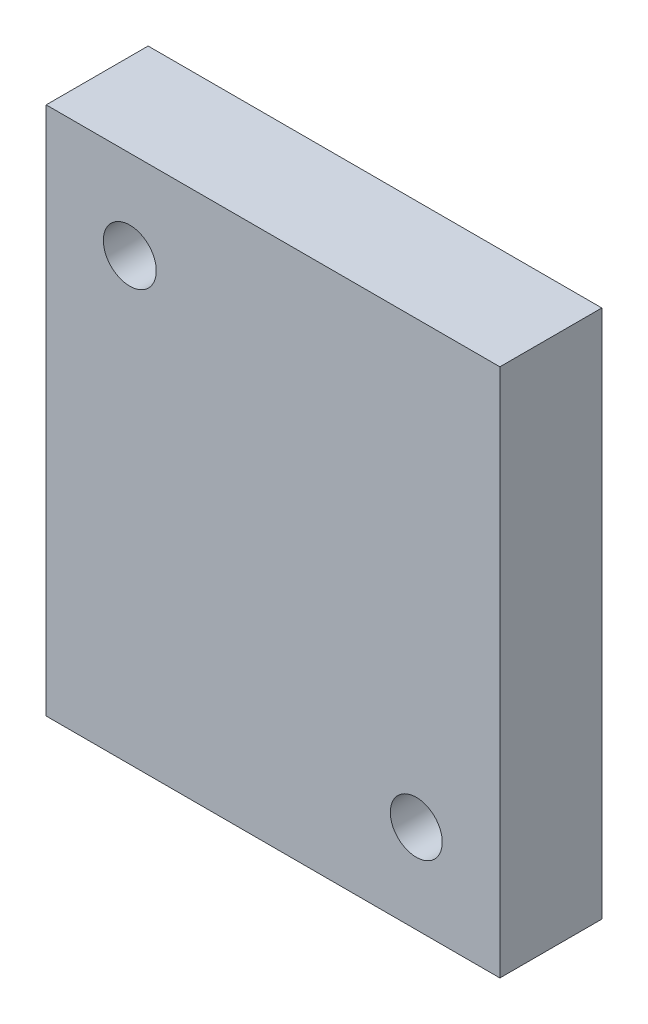
ISO-10303-21;
HEADER;
FILE_DESCRIPTION(('STEP AP214'),'2;1');
FILE_NAME('part.step','',(''),(''),'','','');
FILE_SCHEMA(('AUTOMOTIVE_DESIGN { 1 0 10303 214 1 1 1 1 }'));
ENDSEC;
DATA;
#1=APPLICATION_CONTEXT('core data for automotive mechanical design processes');
#2=APPLICATION_PROTOCOL_DEFINITION('international standard','automotive_design',2000,#1);
#3=PRODUCT_CONTEXT('',#1,'mechanical');
#4=PRODUCT('Part','Part','',(#3));
#5=PRODUCT_RELATED_PRODUCT_CATEGORY('part','',(#4));
#6=PRODUCT_DEFINITION_FORMATION('','',#4);
#7=PRODUCT_DEFINITION_CONTEXT('part definition',#1,'design');
#8=PRODUCT_DEFINITION('design','',#6,#7);
#9=PRODUCT_DEFINITION_SHAPE('','',#8);
#10=(LENGTH_UNIT() NAMED_UNIT(*) SI_UNIT(.MILLI.,.METRE.));
#11=(NAMED_UNIT(*) PLANE_ANGLE_UNIT() SI_UNIT($,.RADIAN.));
#12=(NAMED_UNIT(*) SI_UNIT($,.STERADIAN.) SOLID_ANGLE_UNIT());
#13=UNCERTAINTY_MEASURE_WITH_UNIT(LENGTH_MEASURE(1.E-05),#10,'distance_accuracy_value','');
#14=(GEOMETRIC_REPRESENTATION_CONTEXT(3) GLOBAL_UNCERTAINTY_ASSIGNED_CONTEXT((#13)) GLOBAL_UNIT_ASSIGNED_CONTEXT((#10,
#11,#12)) REPRESENTATION_CONTEXT('',''));
#15=CARTESIAN_POINT('',(0.,0.,0.));
#16=DIRECTION('',(0.,0.,1.));
#17=DIRECTION('',(1.,0.,0.));
#18=AXIS2_PLACEMENT_3D('',#15,#16,#17);
#19=CARTESIAN_POINT('',(30.,35.,13.48));
#20=DIRECTION('',(-1.,0.,0.));
#21=DIRECTION('',(0.,0.,1.));
#22=AXIS2_PLACEMENT_3D('',#19,#20,#21);
#23=PLANE('',#22);
#24=DIRECTION('',(0.,1.,0.));
#25=VECTOR('',#24,1.);
#26=CARTESIAN_POINT('',(30.,35.,0.));
#27=LINE('',#26,#25);
#28=CARTESIAN_POINT('',(30.,-35.,0.));
#29=VERTEX_POINT('',#28);
#30=CARTESIAN_POINT('',(30.,35.,0.));
#31=VERTEX_POINT('',#30);
#32=EDGE_CURVE('E116',#29,#31,#27,.T.);
#33=ORIENTED_EDGE('',*,*,#32,.T.);
#34=DIRECTION('',(0.,0.,-1.));
#35=VECTOR('',#34,1.);
#36=CARTESIAN_POINT('',(30.,35.,13.48));
#37=LINE('',#36,#35);
#38=CARTESIAN_POINT('',(30.,35.,13.48));
#39=VERTEX_POINT('',#38);
#40=EDGE_CURVE('E12',#39,#31,#37,.T.);
#41=ORIENTED_EDGE('',*,*,#40,.F.);
#42=DIRECTION('',(0.,1.,0.));
#43=VECTOR('',#42,1.);
#44=CARTESIAN_POINT('',(30.,35.,13.48));
#45=LINE('',#44,#43);
#46=CARTESIAN_POINT('',(30.,-35.,13.48));
#47=VERTEX_POINT('',#46);
#48=EDGE_CURVE('E93',#47,#39,#45,.T.);
#49=ORIENTED_EDGE('',*,*,#48,.F.);
#50=DIRECTION('',(0.,0.,-1.));
#51=VECTOR('',#50,1.);
#52=CARTESIAN_POINT('',(30.,-35.,13.48));
#53=LINE('',#52,#51);
#54=EDGE_CURVE('E101',#47,#29,#53,.T.);
#55=ORIENTED_EDGE('',*,*,#54,.T.);
#56=EDGE_LOOP('',(#33,#41,#49,#55));
#57=FACE_BOUND('',#56,.T.);
#58=ADVANCED_FACE('F41',(#57),#23,.F.);
#59=CARTESIAN_POINT('',(-30.,35.,13.48));
#60=DIRECTION('',(0.,-1.,0.));
#61=DIRECTION('',(0.,0.,-1.));
#62=AXIS2_PLACEMENT_3D('',#59,#60,#61);
#63=PLANE('',#62);
#64=DIRECTION('',(-1.,0.,0.));
#65=VECTOR('',#64,1.);
#66=CARTESIAN_POINT('',(-30.,35.,0.));
#67=LINE('',#66,#65);
#68=CARTESIAN_POINT('',(-30.,35.,0.));
#69=VERTEX_POINT('',#68);
#70=EDGE_CURVE('E97',#31,#69,#67,.T.);
#71=ORIENTED_EDGE('',*,*,#70,.T.);
#72=DIRECTION('',(0.,0.,-1.));
#73=VECTOR('',#72,1.);
#74=CARTESIAN_POINT('',(-30.,35.,13.48));
#75=LINE('',#74,#73);
#76=CARTESIAN_POINT('',(-30.,35.,13.48));
#77=VERTEX_POINT('',#76);
#78=EDGE_CURVE('E50',#77,#69,#75,.T.);
#79=ORIENTED_EDGE('',*,*,#78,.F.);
#80=DIRECTION('',(-1.,0.,0.));
#81=VECTOR('',#80,1.);
#82=CARTESIAN_POINT('',(-30.,35.,13.48));
#83=LINE('',#82,#81);
#84=EDGE_CURVE('E88',#39,#77,#83,.T.);
#85=ORIENTED_EDGE('',*,*,#84,.F.);
#86=ORIENTED_EDGE('',*,*,#40,.T.);
#87=EDGE_LOOP('',(#71,#79,#85,#86));
#88=FACE_BOUND('',#87,.T.);
#89=ADVANCED_FACE('F96',(#88),#63,.F.);
#90=CARTESIAN_POINT('',(-30.,35.,13.48));
#91=DIRECTION('',(1.,0.,0.));
#92=DIRECTION('',(0.,0.,-1.));
#93=AXIS2_PLACEMENT_3D('',#90,#91,#92);
#94=PLANE('',#93);
#95=DIRECTION('',(0.,-1.,0.));
#96=VECTOR('',#95,1.);
#97=CARTESIAN_POINT('',(-30.,35.,0.));
#98=LINE('',#97,#96);
#99=CARTESIAN_POINT('',(-30.,-35.,0.));
#100=VERTEX_POINT('',#99);
#101=EDGE_CURVE('E75',#69,#100,#98,.T.);
#102=ORIENTED_EDGE('',*,*,#101,.T.);
#103=DIRECTION('',(0.,0.,-1.));
#104=VECTOR('',#103,1.);
#105=CARTESIAN_POINT('',(-30.,-35.,13.48));
#106=LINE('',#105,#104);
#107=CARTESIAN_POINT('',(-30.,-35.,13.48));
#108=VERTEX_POINT('',#107);
#109=EDGE_CURVE('E98',#108,#100,#106,.T.);
#110=ORIENTED_EDGE('',*,*,#109,.F.);
#111=DIRECTION('',(0.,-1.,0.));
#112=VECTOR('',#111,1.);
#113=CARTESIAN_POINT('',(-30.,35.,13.48));
#114=LINE('',#113,#112);
#115=EDGE_CURVE('E91',#77,#108,#114,.T.);
#116=ORIENTED_EDGE('',*,*,#115,.F.);
#117=ORIENTED_EDGE('',*,*,#78,.T.);
#118=EDGE_LOOP('',(#102,#110,#116,#117));
#119=FACE_BOUND('',#118,.T.);
#120=ADVANCED_FACE('F99',(#119),#94,.F.);
#121=CARTESIAN_POINT('',(-30.,-35.,13.48));
#122=DIRECTION('',(0.,1.,0.));
#123=DIRECTION('',(0.,0.,1.));
#124=AXIS2_PLACEMENT_3D('',#121,#122,#123);
#125=PLANE('',#124);
#126=DIRECTION('',(1.,0.,0.));
#127=VECTOR('',#126,1.);
#128=CARTESIAN_POINT('',(-30.,-35.,0.));
#129=LINE('',#128,#127);
#130=EDGE_CURVE('E81',#100,#29,#129,.T.);
#131=ORIENTED_EDGE('',*,*,#130,.T.);
#132=ORIENTED_EDGE('',*,*,#54,.F.);
#133=DIRECTION('',(1.,0.,0.));
#134=VECTOR('',#133,1.);
#135=CARTESIAN_POINT('',(-30.,-35.,13.48));
#136=LINE('',#135,#134);
#137=EDGE_CURVE('E58',#108,#47,#136,.T.);
#138=ORIENTED_EDGE('',*,*,#137,.F.);
#139=ORIENTED_EDGE('',*,*,#109,.T.);
#140=EDGE_LOOP('',(#131,#132,#138,#139));
#141=FACE_BOUND('',#140,.T.);
#142=ADVANCED_FACE('F158',(#141),#125,.F.);
#143=CARTESIAN_POINT('',(0.,0.,13.48));
#144=DIRECTION('',(0.,0.,1.));
#145=DIRECTION('',(1.,0.,0.));
#146=AXIS2_PLACEMENT_3D('',#143,#144,#145);
#147=PLANE('',#146);
#148=CARTESIAN_POINT('',(18.9425412312998,-23.2632786103014,13.48));
#149=DIRECTION('',(0.,0.,1.));
#150=DIRECTION('',(1.,0.,0.));
#151=AXIS2_PLACEMENT_3D('',#148,#149,#150);
#152=CIRCLE('',#151,3.4348719797879);
#153=CARTESIAN_POINT('',(15.5076692515119,-23.2632786103014,13.48));
#154=VERTEX_POINT('',#153);
#155=EDGE_CURVE('E112',#154,#154,#152,.T.);
#156=ORIENTED_EDGE('',*,*,#155,.F.);
#157=EDGE_LOOP('',(#156));
#158=FACE_BOUND('',#157,.T.);
#159=CARTESIAN_POINT('',(-18.9425412312998,23.2632786103014,13.48));
#160=DIRECTION('',(0.,0.,1.));
#161=DIRECTION('',(1.,0.,0.));
#162=AXIS2_PLACEMENT_3D('',#159,#160,#161);
#163=CIRCLE('',#162,3.5);
#164=CARTESIAN_POINT('',(-22.4425412312998,23.2632786103014,13.48));
#165=VERTEX_POINT('',#164);
#166=EDGE_CURVE('E117',#165,#165,#163,.T.);
#167=ORIENTED_EDGE('',*,*,#166,.F.);
#168=EDGE_LOOP('',(#167));
#169=FACE_BOUND('',#168,.T.);
#170=ORIENTED_EDGE('',*,*,#48,.T.);
#171=ORIENTED_EDGE('',*,*,#84,.T.);
#172=ORIENTED_EDGE('',*,*,#115,.T.);
#173=ORIENTED_EDGE('',*,*,#137,.T.);
#174=EDGE_LOOP('',(#170,#171,#172,#173));
#175=FACE_BOUND('',#174,.T.);
#176=ADVANCED_FACE('F89',(#158,#169,#175),#147,.T.);
#177=CARTESIAN_POINT('',(0.,0.,0.));
#178=DIRECTION('',(0.,0.,1.));
#179=DIRECTION('',(1.,0.,0.));
#180=AXIS2_PLACEMENT_3D('',#177,#178,#179);
#181=PLANE('',#180);
#182=CARTESIAN_POINT('',(18.9425412312998,-23.2632786103014,0.));
#183=DIRECTION('',(0.,0.,-1.));
#184=DIRECTION('',(-1.,0.,0.));
#185=AXIS2_PLACEMENT_3D('',#182,#183,#184);
#186=CIRCLE('',#185,3.4348719797879);
#187=CARTESIAN_POINT('',(15.5076692515119,-23.2632786103014,0.));
#188=VERTEX_POINT('',#187);
#189=EDGE_CURVE('E145',#188,#188,#186,.T.);
#190=ORIENTED_EDGE('',*,*,#189,.F.);
#191=EDGE_LOOP('',(#190));
#192=FACE_BOUND('',#191,.T.);
#193=CARTESIAN_POINT('',(-18.9425412312998,23.2632786103014,0.));
#194=DIRECTION('',(0.,0.,-1.));
#195=DIRECTION('',(-1.,0.,0.));
#196=AXIS2_PLACEMENT_3D('',#193,#194,#195);
#197=CIRCLE('',#196,3.5);
#198=CARTESIAN_POINT('',(-22.4425412312998,23.2632786103014,0.));
#199=VERTEX_POINT('',#198);
#200=EDGE_CURVE('E142',#199,#199,#197,.T.);
#201=ORIENTED_EDGE('',*,*,#200,.F.);
#202=EDGE_LOOP('',(#201));
#203=FACE_BOUND('',#202,.T.);
#204=ORIENTED_EDGE('',*,*,#32,.F.);
#205=ORIENTED_EDGE('',*,*,#130,.F.);
#206=ORIENTED_EDGE('',*,*,#101,.F.);
#207=ORIENTED_EDGE('',*,*,#70,.F.);
#208=EDGE_LOOP('',(#204,#205,#206,#207));
#209=FACE_BOUND('',#208,.T.);
#210=ADVANCED_FACE('F157',(#192,#203,#209),#181,.F.);
#211=CARTESIAN_POINT('',(-18.9425412312998,23.2632786103014,29.));
#212=DIRECTION('',(0.,0.,-1.));
#213=DIRECTION('',(-1.,0.,0.));
#214=AXIS2_PLACEMENT_3D('',#211,#212,#213);
#215=CYLINDRICAL_SURFACE('',#214,3.5);
#216=CARTESIAN_POINT('',(-22.4425412312998,23.2632786103014,13.48));
#217=CARTESIAN_POINT('',(-22.4425412312998,23.2632786103014,13.3395833333333));
#218=CARTESIAN_POINT('',(-22.4425412312998,23.2632786103014,13.1991666666667));
#219=CARTESIAN_POINT('',(-22.4425412312998,23.2632786103014,12.9183333333333));
#220=CARTESIAN_POINT('',(-22.4425412312998,23.2632786103014,12.7779166666667));
#221=CARTESIAN_POINT('',(-22.4425412312998,23.2632786103014,12.4970833333333));
#222=CARTESIAN_POINT('',(-22.4425412312998,23.2632786103014,12.3566666666667));
#223=CARTESIAN_POINT('',(-22.4425412312998,23.2632786103014,12.0758333333333));
#224=CARTESIAN_POINT('',(-22.4425412312998,23.2632786103014,11.9354166666667));
#225=CARTESIAN_POINT('',(-22.4425412312998,23.2632786103014,11.6545833333333));
#226=CARTESIAN_POINT('',(-22.4425412312998,23.2632786103014,11.5141666666667));
#227=CARTESIAN_POINT('',(-22.4425412312998,23.2632786103014,11.2333333333333));
#228=CARTESIAN_POINT('',(-22.4425412312998,23.2632786103014,11.0929166666667));
#229=CARTESIAN_POINT('',(-22.4425412312998,23.2632786103014,10.8120833333333));
#230=CARTESIAN_POINT('',(-22.4425412312998,23.2632786103014,10.6716666666667));
#231=CARTESIAN_POINT('',(-22.4425412312998,23.2632786103014,10.3908333333333));
#232=CARTESIAN_POINT('',(-22.4425412312998,23.2632786103014,10.2504166666667));
#233=CARTESIAN_POINT('',(-22.4425412312998,23.2632786103014,9.96958333333334));
#234=CARTESIAN_POINT('',(-22.4425412312998,23.2632786103014,9.82916666666667));
#235=CARTESIAN_POINT('',(-22.4425412312998,23.2632786103014,9.54833333333334));
#236=CARTESIAN_POINT('',(-22.4425412312998,23.2632786103014,9.40791666666667));
#237=CARTESIAN_POINT('',(-22.4425412312998,23.2632786103014,9.12708333333333));
#238=CARTESIAN_POINT('',(-22.4425412312998,23.2632786103014,8.98666666666667));
#239=CARTESIAN_POINT('',(-22.4425412312998,23.2632786103014,8.70583333333333));
#240=CARTESIAN_POINT('',(-22.4425412312998,23.2632786103014,8.56541666666667));
#241=CARTESIAN_POINT('',(-22.4425412312998,23.2632786103014,8.28458333333334));
#242=CARTESIAN_POINT('',(-22.4425412312998,23.2632786103014,8.14416666666667));
#243=CARTESIAN_POINT('',(-22.4425412312998,23.2632786103014,7.86333333333334));
#244=CARTESIAN_POINT('',(-22.4425412312998,23.2632786103014,7.72291666666667));
#245=CARTESIAN_POINT('',(-22.4425412312998,23.2632786103014,7.44208333333334));
#246=CARTESIAN_POINT('',(-22.4425412312998,23.2632786103014,7.30166666666667));
#247=CARTESIAN_POINT('',(-22.4425412312998,23.2632786103014,7.02083333333333));
#248=CARTESIAN_POINT('',(-22.4425412312998,23.2632786103014,6.88041666666667));
#249=CARTESIAN_POINT('',(-22.4425412312998,23.2632786103014,6.59958333333334));
#250=CARTESIAN_POINT('',(-22.4425412312998,23.2632786103014,6.45916666666667));
#251=CARTESIAN_POINT('',(-22.4425412312998,23.2632786103014,6.17833333333333));
#252=CARTESIAN_POINT('',(-22.4425412312998,23.2632786103014,6.03791666666667));
#253=CARTESIAN_POINT('',(-22.4425412312998,23.2632786103014,5.75708333333333));
#254=CARTESIAN_POINT('',(-22.4425412312998,23.2632786103014,5.61666666666667));
#255=CARTESIAN_POINT('',(-22.4425412312998,23.2632786103014,5.33583333333334));
#256=CARTESIAN_POINT('',(-22.4425412312998,23.2632786103014,5.19541666666667));
#257=CARTESIAN_POINT('',(-22.4425412312998,23.2632786103014,4.91458333333333));
#258=CARTESIAN_POINT('',(-22.4425412312998,23.2632786103014,4.77416666666667));
#259=CARTESIAN_POINT('',(-22.4425412312998,23.2632786103014,4.49333333333333));
#260=CARTESIAN_POINT('',(-22.4425412312998,23.2632786103014,4.35291666666667));
#261=CARTESIAN_POINT('',(-22.4425412312998,23.2632786103014,4.07208333333333));
#262=CARTESIAN_POINT('',(-22.4425412312998,23.2632786103014,3.93166666666667));
#263=CARTESIAN_POINT('',(-22.4425412312998,23.2632786103014,3.65083333333334));
#264=CARTESIAN_POINT('',(-22.4425412312998,23.2632786103014,3.51041666666667));
#265=CARTESIAN_POINT('',(-22.4425412312998,23.2632786103014,3.22958333333333));
#266=CARTESIAN_POINT('',(-22.4425412312998,23.2632786103014,3.08916666666667));
#267=CARTESIAN_POINT('',(-22.4425412312998,23.2632786103014,2.80833333333333));
#268=CARTESIAN_POINT('',(-22.4425412312998,23.2632786103014,2.66791666666667));
#269=CARTESIAN_POINT('',(-22.4425412312998,23.2632786103014,2.38708333333333));
#270=CARTESIAN_POINT('',(-22.4425412312998,23.2632786103014,2.24666666666667));
#271=CARTESIAN_POINT('',(-22.4425412312998,23.2632786103014,1.96583333333333));
#272=CARTESIAN_POINT('',(-22.4425412312998,23.2632786103014,1.82541666666667));
#273=CARTESIAN_POINT('',(-22.4425412312998,23.2632786103014,1.54458333333333));
#274=CARTESIAN_POINT('',(-22.4425412312998,23.2632786103014,1.40416666666667));
#275=CARTESIAN_POINT('',(-22.4425412312998,23.2632786103014,1.12333333333333));
#276=CARTESIAN_POINT('',(-22.4425412312998,23.2632786103014,0.982916666666667));
#277=CARTESIAN_POINT('',(-22.4425412312998,23.2632786103014,0.702083333333332));
#278=CARTESIAN_POINT('',(-22.4425412312998,23.2632786103014,0.561666666666665));
#279=CARTESIAN_POINT('',(-22.4425412312998,23.2632786103014,0.280833333333332));
#280=CARTESIAN_POINT('',(-22.4425412312998,23.2632786103014,0.140416666666666));
#281=CARTESIAN_POINT('',(-22.4425412312998,23.2632786103014,0.));
#282=B_SPLINE_CURVE_WITH_KNOTS('',3,(#216,#217,#218,#219,#220,#221,#222,#223,#224,#225,#226,
#227,#228,#229,#230,#231,#232,#233,#234,#235,#236,#237,#238,#239,#240,#241,#242,#243,#244,#245,
#246,#247,#248,#249,#250,#251,#252,#253,#254,#255,#256,#257,#258,#259,#260,#261,#262,#263,#264,
#265,#266,#267,#268,#269,#270,#271,#272,#273,#274,#275,#276,#277,#278,#279,#280,#281),
.UNSPECIFIED.,.F.,.F.,(4,2,2,2,2,2,2,2,2,2,2,2,2,2,2,2,2,2,2,2,2,2,2,2,2,2,2,2,2,2,2,2,4),(0.,
0.42125,0.842499999999998,1.26375,1.685,2.10625,2.5275,2.94875,3.37,3.79125,4.2125,4.63375,
5.055,5.47625,5.8975,6.31875,6.74,7.16125,7.5825,8.00375,8.425,8.84625,9.2675,9.68875,10.11,
10.53125,10.9525,11.37375,11.795,12.21625,12.6375,13.05875,13.48),.UNSPECIFIED.);
#283=EDGE_CURVE('BSEAM153',#165,#199,#282,.T.);
#284=ORIENTED_EDGE('',*,*,#166,.T.);
#285=ORIENTED_EDGE('',*,*,#200,.T.);
#286=ORIENTED_EDGE('',*,*,#283,.T.);
#287=ORIENTED_EDGE('',*,*,#283,.F.);
#288=EDGE_LOOP('',(#284,#286,#285,#287));
#289=FACE_BOUND('',#288,.T.);
#290=ADVANCED_FACE('F153',(#289),#215,.F.);
#291=CARTESIAN_POINT('',(18.9425412312998,-23.2632786103014,29.));
#292=DIRECTION('',(0.,0.,-1.));
#293=DIRECTION('',(-1.,0.,0.));
#294=AXIS2_PLACEMENT_3D('',#291,#292,#293);
#295=CYLINDRICAL_SURFACE('',#294,3.4348719797879);
#296=CARTESIAN_POINT('',(15.5076692515119,-23.2632786103014,13.48));
#297=CARTESIAN_POINT('',(15.5076692515119,-23.2632786103014,13.3395833333333));
#298=CARTESIAN_POINT('',(15.5076692515119,-23.2632786103014,13.1991666666667));
#299=CARTESIAN_POINT('',(15.5076692515119,-23.2632786103014,12.9183333333333));
#300=CARTESIAN_POINT('',(15.5076692515119,-23.2632786103014,12.7779166666667));
#301=CARTESIAN_POINT('',(15.5076692515119,-23.2632786103014,12.4970833333333));
#302=CARTESIAN_POINT('',(15.5076692515119,-23.2632786103014,12.3566666666667));
#303=CARTESIAN_POINT('',(15.5076692515119,-23.2632786103014,12.0758333333333));
#304=CARTESIAN_POINT('',(15.5076692515119,-23.2632786103014,11.9354166666667));
#305=CARTESIAN_POINT('',(15.5076692515119,-23.2632786103014,11.6545833333333));
#306=CARTESIAN_POINT('',(15.5076692515119,-23.2632786103014,11.5141666666667));
#307=CARTESIAN_POINT('',(15.5076692515119,-23.2632786103014,11.2333333333333));
#308=CARTESIAN_POINT('',(15.5076692515119,-23.2632786103014,11.0929166666667));
#309=CARTESIAN_POINT('',(15.5076692515119,-23.2632786103014,10.8120833333333));
#310=CARTESIAN_POINT('',(15.5076692515119,-23.2632786103014,10.6716666666667));
#311=CARTESIAN_POINT('',(15.5076692515119,-23.2632786103014,10.3908333333333));
#312=CARTESIAN_POINT('',(15.5076692515119,-23.2632786103014,10.2504166666667));
#313=CARTESIAN_POINT('',(15.5076692515119,-23.2632786103014,9.96958333333334));
#314=CARTESIAN_POINT('',(15.5076692515119,-23.2632786103014,9.82916666666667));
#315=CARTESIAN_POINT('',(15.5076692515119,-23.2632786103014,9.54833333333334));
#316=CARTESIAN_POINT('',(15.5076692515119,-23.2632786103014,9.40791666666667));
#317=CARTESIAN_POINT('',(15.5076692515119,-23.2632786103014,9.12708333333333));
#318=CARTESIAN_POINT('',(15.5076692515119,-23.2632786103014,8.98666666666667));
#319=CARTESIAN_POINT('',(15.5076692515119,-23.2632786103014,8.70583333333333));
#320=CARTESIAN_POINT('',(15.5076692515119,-23.2632786103014,8.56541666666667));
#321=CARTESIAN_POINT('',(15.5076692515119,-23.2632786103014,8.28458333333334));
#322=CARTESIAN_POINT('',(15.5076692515119,-23.2632786103014,8.14416666666667));
#323=CARTESIAN_POINT('',(15.5076692515119,-23.2632786103014,7.86333333333334));
#324=CARTESIAN_POINT('',(15.5076692515119,-23.2632786103014,7.72291666666667));
#325=CARTESIAN_POINT('',(15.5076692515119,-23.2632786103014,7.44208333333334));
#326=CARTESIAN_POINT('',(15.5076692515119,-23.2632786103014,7.30166666666667));
#327=CARTESIAN_POINT('',(15.5076692515119,-23.2632786103014,7.02083333333333));
#328=CARTESIAN_POINT('',(15.5076692515119,-23.2632786103014,6.88041666666667));
#329=CARTESIAN_POINT('',(15.5076692515119,-23.2632786103014,6.59958333333334));
#330=CARTESIAN_POINT('',(15.5076692515119,-23.2632786103014,6.45916666666667));
#331=CARTESIAN_POINT('',(15.5076692515119,-23.2632786103014,6.17833333333333));
#332=CARTESIAN_POINT('',(15.5076692515119,-23.2632786103014,6.03791666666667));
#333=CARTESIAN_POINT('',(15.5076692515119,-23.2632786103014,5.75708333333333));
#334=CARTESIAN_POINT('',(15.5076692515119,-23.2632786103014,5.61666666666667));
#335=CARTESIAN_POINT('',(15.5076692515119,-23.2632786103014,5.33583333333334));
#336=CARTESIAN_POINT('',(15.5076692515119,-23.2632786103014,5.19541666666667));
#337=CARTESIAN_POINT('',(15.5076692515119,-23.2632786103014,4.91458333333333));
#338=CARTESIAN_POINT('',(15.5076692515119,-23.2632786103014,4.77416666666667));
#339=CARTESIAN_POINT('',(15.5076692515119,-23.2632786103014,4.49333333333333));
#340=CARTESIAN_POINT('',(15.5076692515119,-23.2632786103014,4.35291666666667));
#341=CARTESIAN_POINT('',(15.5076692515119,-23.2632786103014,4.07208333333333));
#342=CARTESIAN_POINT('',(15.5076692515119,-23.2632786103014,3.93166666666667));
#343=CARTESIAN_POINT('',(15.5076692515119,-23.2632786103014,3.65083333333334));
#344=CARTESIAN_POINT('',(15.5076692515119,-23.2632786103014,3.51041666666667));
#345=CARTESIAN_POINT('',(15.5076692515119,-23.2632786103014,3.22958333333333));
#346=CARTESIAN_POINT('',(15.5076692515119,-23.2632786103014,3.08916666666667));
#347=CARTESIAN_POINT('',(15.5076692515119,-23.2632786103014,2.80833333333333));
#348=CARTESIAN_POINT('',(15.5076692515119,-23.2632786103014,2.66791666666667));
#349=CARTESIAN_POINT('',(15.5076692515119,-23.2632786103014,2.38708333333333));
#350=CARTESIAN_POINT('',(15.5076692515119,-23.2632786103014,2.24666666666667));
#351=CARTESIAN_POINT('',(15.5076692515119,-23.2632786103014,1.96583333333333));
#352=CARTESIAN_POINT('',(15.5076692515119,-23.2632786103014,1.82541666666667));
#353=CARTESIAN_POINT('',(15.5076692515119,-23.2632786103014,1.54458333333333));
#354=CARTESIAN_POINT('',(15.5076692515119,-23.2632786103014,1.40416666666667));
#355=CARTESIAN_POINT('',(15.5076692515119,-23.2632786103014,1.12333333333333));
#356=CARTESIAN_POINT('',(15.5076692515119,-23.2632786103014,0.982916666666667));
#357=CARTESIAN_POINT('',(15.5076692515119,-23.2632786103014,0.702083333333332));
#358=CARTESIAN_POINT('',(15.5076692515119,-23.2632786103014,0.561666666666665));
#359=CARTESIAN_POINT('',(15.5076692515119,-23.2632786103014,0.280833333333332));
#360=CARTESIAN_POINT('',(15.5076692515119,-23.2632786103014,0.140416666666666));
#361=CARTESIAN_POINT('',(15.5076692515119,-23.2632786103014,0.));
#362=B_SPLINE_CURVE_WITH_KNOTS('',3,(#296,#297,#298,#299,#300,#301,#302,#303,#304,#305,#306,
#307,#308,#309,#310,#311,#312,#313,#314,#315,#316,#317,#318,#319,#320,#321,#322,#323,#324,#325,
#326,#327,#328,#329,#330,#331,#332,#333,#334,#335,#336,#337,#338,#339,#340,#341,#342,#343,#344,
#345,#346,#347,#348,#349,#350,#351,#352,#353,#354,#355,#356,#357,#358,#359,#360,#361),
.UNSPECIFIED.,.F.,.F.,(4,2,2,2,2,2,2,2,2,2,2,2,2,2,2,2,2,2,2,2,2,2,2,2,2,2,2,2,2,2,2,2,4),(0.,
0.42125,0.842499999999998,1.26375,1.685,2.10625,2.5275,2.94875,3.37,3.79125,4.2125,4.63375,
5.055,5.47625,5.8975,6.31875,6.74,7.16125,7.5825,8.00375,8.425,8.84625,9.2675,9.68875,10.11,
10.53125,10.9525,11.37375,11.795,12.21625,12.6375,13.05875,13.48),.UNSPECIFIED.);
#363=EDGE_CURVE('BSEAM209',#154,#188,#362,.T.);
#364=ORIENTED_EDGE('',*,*,#155,.T.);
#365=ORIENTED_EDGE('',*,*,#189,.T.);
#366=ORIENTED_EDGE('',*,*,#363,.T.);
#367=ORIENTED_EDGE('',*,*,#363,.F.);
#368=EDGE_LOOP('',(#364,#366,#365,#367));
#369=FACE_BOUND('',#368,.T.);
#370=ADVANCED_FACE('F209',(#369),#295,.F.);
#371=CLOSED_SHELL('',(#58,#89,#120,#142,#176,#210,#290,#370));
#372=MANIFOLD_SOLID_BREP('B2',#371);
#373=ADVANCED_BREP_SHAPE_REPRESENTATION('',(#18,#372),#14);
#374=SHAPE_DEFINITION_REPRESENTATION(#9,#373);
ENDSEC;
END-ISO-10303-21;
